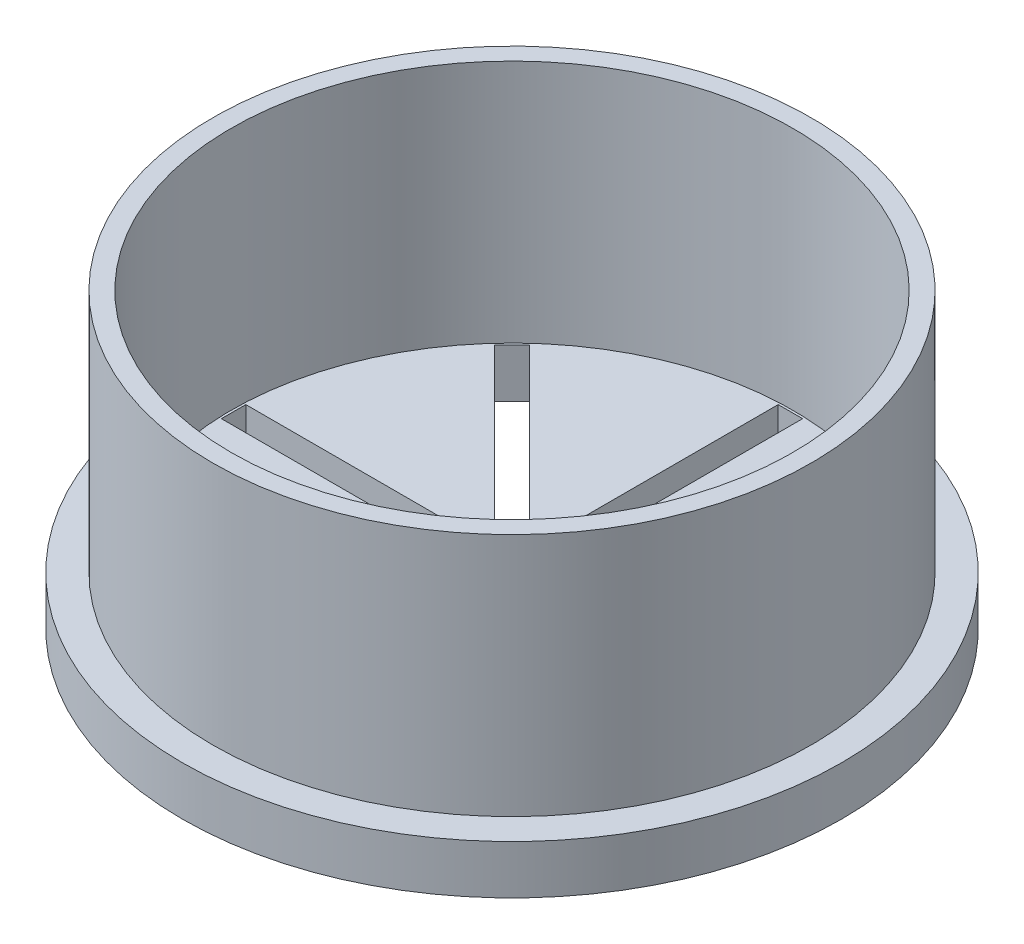
ISO-10303-21;
HEADER;
FILE_DESCRIPTION(('STEP AP214'),'2;1');
FILE_NAME('part.step','',(''),(''),'','','');
FILE_SCHEMA(('AUTOMOTIVE_DESIGN { 1 0 10303 214 1 1 1 1 }'));
ENDSEC;
DATA;
#1=APPLICATION_CONTEXT('core data for automotive mechanical design processes');
#2=APPLICATION_PROTOCOL_DEFINITION('international standard','automotive_design',2000,#1);
#3=PRODUCT_CONTEXT('',#1,'mechanical');
#4=PRODUCT('Part','Part','',(#3));
#5=PRODUCT_RELATED_PRODUCT_CATEGORY('part','',(#4));
#6=PRODUCT_DEFINITION_FORMATION('','',#4);
#7=PRODUCT_DEFINITION_CONTEXT('part definition',#1,'design');
#8=PRODUCT_DEFINITION('design','',#6,#7);
#9=PRODUCT_DEFINITION_SHAPE('','',#8);
#10=(LENGTH_UNIT() NAMED_UNIT(*) SI_UNIT(.MILLI.,.METRE.));
#11=(NAMED_UNIT(*) PLANE_ANGLE_UNIT() SI_UNIT($,.RADIAN.));
#12=(NAMED_UNIT(*) SI_UNIT($,.STERADIAN.) SOLID_ANGLE_UNIT());
#13=UNCERTAINTY_MEASURE_WITH_UNIT(LENGTH_MEASURE(1.E-05),#10,'distance_accuracy_value','');
#14=(GEOMETRIC_REPRESENTATION_CONTEXT(3) GLOBAL_UNCERTAINTY_ASSIGNED_CONTEXT((#13)) GLOBAL_UNIT_ASSIGNED_CONTEXT((#10,
#11,#12)) REPRESENTATION_CONTEXT('',''));
#15=CARTESIAN_POINT('',(0.,0.,0.));
#16=DIRECTION('',(0.,0.,1.));
#17=DIRECTION('',(1.,0.,0.));
#18=AXIS2_PLACEMENT_3D('',#15,#16,#17);
#19=CARTESIAN_POINT('',(0.,2.,0.));
#20=DIRECTION('',(0.,1.,0.));
#21=DIRECTION('',(0.,0.,1.));
#22=AXIS2_PLACEMENT_3D('',#19,#20,#21);
#23=PLANE('',#22);
#24=CARTESIAN_POINT('',(0.,2.,0.));
#25=DIRECTION('',(0.,1.,0.));
#26=DIRECTION('',(0.,0.,1.));
#27=AXIS2_PLACEMENT_3D('',#24,#25,#26);
#28=CIRCLE('',#27,13.5);
#29=CARTESIAN_POINT('',(0.,2.,13.5));
#30=VERTEX_POINT('',#29);
#31=EDGE_CURVE('E12',#30,#30,#28,.T.);
#32=ORIENTED_EDGE('',*,*,#31,.T.);
#33=EDGE_LOOP('',(#32));
#34=FACE_BOUND('',#33,.T.);
#35=CARTESIAN_POINT('',(0.,2.,0.));
#36=DIRECTION('',(0.,1.,0.));
#37=DIRECTION('',(0.,0.,1.));
#38=AXIS2_PLACEMENT_3D('',#35,#36,#37);
#39=CIRCLE('',#38,12.25);
#40=CARTESIAN_POINT('',(0.,2.,12.25));
#41=VERTEX_POINT('',#40);
#42=EDGE_CURVE('E578',#41,#41,#39,.T.);
#43=ORIENTED_EDGE('',*,*,#42,.F.);
#44=EDGE_LOOP('',(#43));
#45=FACE_BOUND('',#44,.T.);
#46=ADVANCED_FACE('F177',(#34,#45),#23,.T.);
#47=CARTESIAN_POINT('',(0.,2.,0.));
#48=DIRECTION('',(0.,-1.,0.));
#49=DIRECTION('',(0.,0.,-1.));
#50=AXIS2_PLACEMENT_3D('',#47,#48,#49);
#51=CYLINDRICAL_SURFACE('',#50,13.5);
#52=ORIENTED_EDGE('',*,*,#31,.F.);
#53=EDGE_LOOP('',(#52));
#54=FACE_BOUND('',#53,.T.);
#55=CARTESIAN_POINT('',(0.,0.,0.));
#56=DIRECTION('',(0.,1.,0.));
#57=DIRECTION('',(0.,0.,1.));
#58=AXIS2_PLACEMENT_3D('',#55,#56,#57);
#59=CIRCLE('',#58,13.5);
#60=CARTESIAN_POINT('',(0.,0.,13.5));
#61=VERTEX_POINT('',#60);
#62=EDGE_CURVE('E181',#61,#61,#59,.T.);
#63=ORIENTED_EDGE('',*,*,#62,.T.);
#64=EDGE_LOOP('',(#63));
#65=FACE_BOUND('',#64,.T.);
#66=ADVANCED_FACE('F179',(#54,#65),#51,.T.);
#67=CARTESIAN_POINT('',(0.,0.,0.));
#68=DIRECTION('',(0.,1.,0.));
#69=DIRECTION('',(0.,0.,1.));
#70=AXIS2_PLACEMENT_3D('',#67,#68,#69);
#71=PLANE('',#70);
#72=DIRECTION('',(-0.707106781186553,0.,-0.707106781186542));
#73=VECTOR('',#72,1.);
#74=CARTESIAN_POINT('',(8.41457069611994,0.,-7.70746391493348));
#75=LINE('',#74,#73);
#76=CARTESIAN_POINT('',(8.41457069611994,0.,-7.70746391493348));
#77=VERTEX_POINT('',#76);
#78=CARTESIAN_POINT('',(7.70746391493339,0.,-8.41457069612002));
#79=VERTEX_POINT('',#78);
#80=EDGE_CURVE('E533',#77,#79,#75,.T.);
#81=ORIENTED_EDGE('',*,*,#80,.T.);
#82=DIRECTION('',(-0.707106781186542,0.,0.707106781186553));
#83=VECTOR('',#82,1.);
#84=CARTESIAN_POINT('',(7.70746391493339,0.,-8.41457069612002));
#85=LINE('',#84,#83);
#86=CARTESIAN_POINT('',(0.500000000000043,0.,-1.20710678118655));
#87=VERTEX_POINT('',#86);
#88=EDGE_CURVE('E288',#79,#87,#85,.T.);
#89=ORIENTED_EDGE('',*,*,#88,.T.);
#90=DIRECTION('',(0.,0.,1.));
#91=VECTOR('',#90,1.);
#92=CARTESIAN_POINT('',(0.499999999999989,0.,-11.4000000000001));
#93=LINE('',#92,#91);
#94=CARTESIAN_POINT('',(0.499999999999989,0.,-11.4000000000001));
#95=VERTEX_POINT('',#94);
#96=EDGE_CURVE('E264',#95,#87,#93,.T.);
#97=ORIENTED_EDGE('',*,*,#96,.F.);
#98=DIRECTION('',(-1.,0.,0.));
#99=VECTOR('',#98,1.);
#100=CARTESIAN_POINT('',(0.499999999999989,0.,-11.4000000000001));
#101=LINE('',#100,#99);
#102=CARTESIAN_POINT('',(-0.500000000000011,0.,-11.4000000000001));
#103=VERTEX_POINT('',#102);
#104=EDGE_CURVE('E275',#95,#103,#101,.T.);
#105=ORIENTED_EDGE('',*,*,#104,.T.);
#106=DIRECTION('',(0.,0.,1.));
#107=VECTOR('',#106,1.);
#108=CARTESIAN_POINT('',(-0.500000000000011,0.,-11.4000000000001));
#109=LINE('',#108,#107);
#110=CARTESIAN_POINT('',(-0.499999999999956,0.,-1.20710678118655));
#111=VERTEX_POINT('',#110);
#112=EDGE_CURVE('E414',#103,#111,#109,.T.);
#113=ORIENTED_EDGE('',*,*,#112,.T.);
#114=DIRECTION('',(0.707106781186549,0.,0.707106781186546));
#115=VECTOR('',#114,1.);
#116=CARTESIAN_POINT('',(-7.70746391493338,0.,-8.41457069611993));
#117=LINE('',#116,#115);
#118=CARTESIAN_POINT('',(-7.70746391493338,0.,-8.41457069611993));
#119=VERTEX_POINT('',#118);
#120=EDGE_CURVE('E389',#119,#111,#117,.T.);
#121=ORIENTED_EDGE('',*,*,#120,.F.);
#122=DIRECTION('',(-0.707106781186545,0.,0.70710678118655));
#123=VECTOR('',#122,1.);
#124=CARTESIAN_POINT('',(-7.70746391493338,0.,-8.41457069611993));
#125=LINE('',#124,#123);
#126=CARTESIAN_POINT('',(-8.41457069611992,0.,-7.70746391493338));
#127=VERTEX_POINT('',#126);
#128=EDGE_CURVE('E378',#119,#127,#125,.T.);
#129=ORIENTED_EDGE('',*,*,#128,.T.);
#130=DIRECTION('',(0.707106781186549,0.,0.707106781186546));
#131=VECTOR('',#130,1.);
#132=CARTESIAN_POINT('',(-8.41457069611992,0.,-7.70746391493338));
#133=LINE('',#132,#131);
#134=CARTESIAN_POINT('',(-1.2071067811865,0.,-0.499999999999999));
#135=VERTEX_POINT('',#134);
#136=EDGE_CURVE('E383',#127,#135,#133,.T.);
#137=ORIENTED_EDGE('',*,*,#136,.T.);
#138=DIRECTION('',(1.,0.,0.));
#139=VECTOR('',#138,1.);
#140=CARTESIAN_POINT('',(-11.4,0.,-0.5));
#141=LINE('',#140,#139);
#142=CARTESIAN_POINT('',(-11.4,0.,-0.5));
#143=VERTEX_POINT('',#142);
#144=EDGE_CURVE('E377',#143,#135,#141,.T.);
#145=ORIENTED_EDGE('',*,*,#144,.F.);
#146=DIRECTION('',(0.,0.,1.));
#147=VECTOR('',#146,1.);
#148=CARTESIAN_POINT('',(-11.4,0.,-0.5));
#149=LINE('',#148,#147);
#150=CARTESIAN_POINT('',(-11.4,0.,0.5));
#151=VERTEX_POINT('',#150);
#152=EDGE_CURVE('E192',#143,#151,#149,.T.);
#153=ORIENTED_EDGE('',*,*,#152,.T.);
#154=DIRECTION('',(1.,0.,0.));
#155=VECTOR('',#154,1.);
#156=CARTESIAN_POINT('',(-11.4,0.,0.5));
#157=LINE('',#156,#155);
#158=CARTESIAN_POINT('',(-1.20710678118648,0.,0.499999999999999));
#159=VERTEX_POINT('',#158);
#160=EDGE_CURVE('E545',#151,#159,#157,.T.);
#161=ORIENTED_EDGE('',*,*,#160,.T.);
#162=CARTESIAN_POINT('',(-8.41457069611976,0.,7.70746391493339));
#163=VERTEX_POINT('',#162);
#164=EDGE_CURVE('E344',#159,#163,#85,.T.);
#165=ORIENTED_EDGE('',*,*,#164,.T.);
#166=DIRECTION('',(-0.707106781186554,0.,-0.707106781186541));
#167=VECTOR('',#166,1.);
#168=CARTESIAN_POINT('',(-7.70746391493321,0.,8.41457069611993));
#169=LINE('',#168,#167);
#170=CARTESIAN_POINT('',(-7.70746391493321,0.,8.41457069611993));
#171=VERTEX_POINT('',#170);
#172=EDGE_CURVE('E573',#171,#163,#169,.T.);
#173=ORIENTED_EDGE('',*,*,#172,.F.);
#174=DIRECTION('',(-0.707106781186542,0.,0.707106781186553));
#175=VECTOR('',#174,1.);
#176=CARTESIAN_POINT('',(8.41457069611994,0.,-7.70746391493348));
#177=LINE('',#176,#175);
#178=CARTESIAN_POINT('',(-0.499999999999944,0.,1.20710678118655));
#179=VERTEX_POINT('',#178);
#180=EDGE_CURVE('E423',#179,#171,#177,.T.);
#181=ORIENTED_EDGE('',*,*,#180,.F.);
#182=CARTESIAN_POINT('',(-0.499999999999888,0.,11.3999999999999));
#183=VERTEX_POINT('',#182);
#184=EDGE_CURVE('E282',#179,#183,#109,.T.);
#185=ORIENTED_EDGE('',*,*,#184,.T.);
#186=DIRECTION('',(-1.,0.,0.));
#187=VECTOR('',#186,1.);
#188=CARTESIAN_POINT('',(0.500000000000112,0.,11.3999999999999));
#189=LINE('',#188,#187);
#190=CARTESIAN_POINT('',(0.500000000000112,0.,11.3999999999999));
#191=VERTEX_POINT('',#190);
#192=EDGE_CURVE('E293',#191,#183,#189,.T.);
#193=ORIENTED_EDGE('',*,*,#192,.F.);
#194=CARTESIAN_POINT('',(0.500000000000057,0.,1.20710678118655));
#195=VERTEX_POINT('',#194);
#196=EDGE_CURVE('E289',#195,#191,#93,.T.);
#197=ORIENTED_EDGE('',*,*,#196,.F.);
#198=CARTESIAN_POINT('',(7.7074639149334,0.,8.41457069611985));
#199=VERTEX_POINT('',#198);
#200=EDGE_CURVE('E381',#195,#199,#133,.T.);
#201=ORIENTED_EDGE('',*,*,#200,.T.);
#202=DIRECTION('',(-0.707106781186545,0.,0.707106781186551));
#203=VECTOR('',#202,1.);
#204=CARTESIAN_POINT('',(8.41457069611995,0.,7.7074639149333));
#205=LINE('',#204,#203);
#206=CARTESIAN_POINT('',(8.41457069611995,0.,7.7074639149333));
#207=VERTEX_POINT('',#206);
#208=EDGE_CURVE('E386',#207,#199,#205,.T.);
#209=ORIENTED_EDGE('',*,*,#208,.F.);
#210=CARTESIAN_POINT('',(1.2071067811866,0.,0.499999999999999));
#211=VERTEX_POINT('',#210);
#212=EDGE_CURVE('E388',#211,#207,#117,.T.);
#213=ORIENTED_EDGE('',*,*,#212,.F.);
#214=CARTESIAN_POINT('',(11.4,0.,0.5));
#215=VERTEX_POINT('',#214);
#216=EDGE_CURVE('E544',#211,#215,#157,.T.);
#217=ORIENTED_EDGE('',*,*,#216,.T.);
#218=DIRECTION('',(0.,0.,1.));
#219=VECTOR('',#218,1.);
#220=CARTESIAN_POINT('',(11.4,0.,-0.5));
#221=LINE('',#220,#219);
#222=CARTESIAN_POINT('',(11.4,0.,-0.5));
#223=VERTEX_POINT('',#222);
#224=EDGE_CURVE('E547',#223,#215,#221,.T.);
#225=ORIENTED_EDGE('',*,*,#224,.F.);
#226=CARTESIAN_POINT('',(1.20710678118658,0.,-0.5));
#227=VERTEX_POINT('',#226);
#228=EDGE_CURVE('E548',#227,#223,#141,.T.);
#229=ORIENTED_EDGE('',*,*,#228,.F.);
#230=EDGE_CURVE('E542',#77,#227,#177,.T.);
#231=ORIENTED_EDGE('',*,*,#230,.F.);
#232=EDGE_LOOP('',(#81,#89,#97,#105,#113,#121,#129,#137,#145,#153,#161,#165,#173,#181,#185,#193,
#197,#201,#209,#213,#217,#225,#229,#231));
#233=FACE_BOUND('',#232,.T.);
#234=ORIENTED_EDGE('',*,*,#62,.F.);
#235=EDGE_LOOP('',(#234));
#236=FACE_BOUND('',#235,.T.);
#237=ADVANCED_FACE('F285',(#233,#236),#71,.F.);
#238=CARTESIAN_POINT('',(8.41457069611994,0.,-7.70746391493348));
#239=DIRECTION('',(-0.707106781186553,0.,-0.707106781186542));
#240=DIRECTION('',(-0.707106781186542,0.,0.707106781186553));
#241=AXIS2_PLACEMENT_3D('',#238,#239,#240);
#242=PLANE('',#241);
#243=ORIENTED_EDGE('',*,*,#180,.T.);
#244=DIRECTION('',(0.,1.,0.));
#245=VECTOR('',#244,1.);
#246=CARTESIAN_POINT('',(-7.70746391493321,0.,8.41457069611993));
#247=LINE('',#246,#245);
#248=CARTESIAN_POINT('',(-7.70746391493321,2.,8.41457069611993));
#249=VERTEX_POINT('',#248);
#250=EDGE_CURVE('E536',#171,#249,#247,.T.);
#251=ORIENTED_EDGE('',*,*,#250,.T.);
#252=DIRECTION('',(-0.707106781186542,0.,0.707106781186553));
#253=VECTOR('',#252,1.);
#254=CARTESIAN_POINT('',(8.41457069611994,2.,-7.70746391493348));
#255=LINE('',#254,#253);
#256=CARTESIAN_POINT('',(-0.499999999999943,2.,1.20710678118655));
#257=VERTEX_POINT('',#256);
#258=EDGE_CURVE('E526',#257,#249,#255,.T.);
#259=ORIENTED_EDGE('',*,*,#258,.F.);
#260=DIRECTION('',(0.,1.,0.));
#261=VECTOR('',#260,1.);
#262=CARTESIAN_POINT('',(-0.499999999999945,0.,1.20710678118656));
#263=LINE('',#262,#261);
#264=EDGE_CURVE('E325',#179,#257,#263,.T.);
#265=ORIENTED_EDGE('',*,*,#264,.F.);
#266=EDGE_LOOP('',(#243,#251,#259,#265));
#267=FACE_BOUND('',#266,.T.);
#268=ADVANCED_FACE('F619',(#267),#242,.T.);
#269=CARTESIAN_POINT('',(-7.70746391493321,0.,8.41457069611993));
#270=DIRECTION('',(0.707106781186541,0.,-0.707106781186554));
#271=DIRECTION('',(-0.707106781186554,0.,-0.707106781186541));
#272=AXIS2_PLACEMENT_3D('',#269,#270,#271);
#273=PLANE('',#272);
#274=DIRECTION('',(-0.707106781186554,0.,-0.707106781186541));
#275=VECTOR('',#274,1.);
#276=CARTESIAN_POINT('',(-7.70746391493321,2.,8.41457069611993));
#277=LINE('',#276,#275);
#278=CARTESIAN_POINT('',(-8.41457069611976,2.,7.7074639149334));
#279=VERTEX_POINT('',#278);
#280=EDGE_CURVE('E524',#249,#279,#277,.T.);
#281=ORIENTED_EDGE('',*,*,#280,.F.);
#282=ORIENTED_EDGE('',*,*,#250,.F.);
#283=ORIENTED_EDGE('',*,*,#172,.T.);
#284=DIRECTION('',(0.,1.,0.));
#285=VECTOR('',#284,1.);
#286=CARTESIAN_POINT('',(-8.41457069611976,0.,7.70746391493339));
#287=LINE('',#286,#285);
#288=EDGE_CURVE('E539',#163,#279,#287,.T.);
#289=ORIENTED_EDGE('',*,*,#288,.T.);
#290=EDGE_LOOP('',(#281,#282,#283,#289));
#291=FACE_BOUND('',#290,.T.);
#292=ADVANCED_FACE('F623',(#291),#273,.T.);
#293=CARTESIAN_POINT('',(7.70746391493339,0.,-8.41457069612002));
#294=DIRECTION('',(-0.707106781186553,0.,-0.707106781186542));
#295=DIRECTION('',(-0.707106781186542,0.,0.707106781186553));
#296=AXIS2_PLACEMENT_3D('',#293,#294,#295);
#297=PLANE('',#296);
#298=DIRECTION('',(0.,1.,0.));
#299=VECTOR('',#298,1.);
#300=CARTESIAN_POINT('',(-1.20710678118648,0.,0.5));
#301=LINE('',#300,#299);
#302=CARTESIAN_POINT('',(-1.20710678118648,2.,0.5));
#303=VERTEX_POINT('',#302);
#304=EDGE_CURVE('E201',#159,#303,#301,.T.);
#305=ORIENTED_EDGE('',*,*,#304,.T.);
#306=DIRECTION('',(-0.707106781186542,0.,0.707106781186553));
#307=VECTOR('',#306,1.);
#308=CARTESIAN_POINT('',(7.70746391493339,2.,-8.41457069612002));
#309=LINE('',#308,#307);
#310=EDGE_CURVE('E341',#303,#279,#309,.T.);
#311=ORIENTED_EDGE('',*,*,#310,.T.);
#312=ORIENTED_EDGE('',*,*,#288,.F.);
#313=ORIENTED_EDGE('',*,*,#164,.F.);
#314=EDGE_LOOP('',(#305,#311,#312,#313));
#315=FACE_BOUND('',#314,.T.);
#316=ADVANCED_FACE('F337',(#315),#297,.F.);
#317=CARTESIAN_POINT('',(-7.70746391493338,0.,-8.41457069611993));
#318=DIRECTION('',(-0.707106781186546,0.,0.707106781186549));
#319=DIRECTION('',(0.707106781186549,0.,0.707106781186546));
#320=AXIS2_PLACEMENT_3D('',#317,#318,#319);
#321=PLANE('',#320);
#322=DIRECTION('',(0.,-1.,0.));
#323=VECTOR('',#322,1.);
#324=CARTESIAN_POINT('',(1.2071067811866,0.,0.5));
#325=LINE('',#324,#323);
#326=CARTESIAN_POINT('',(1.2071067811866,2.,0.5));
#327=VERTEX_POINT('',#326);
#328=EDGE_CURVE('E319',#327,#211,#325,.T.);
#329=ORIENTED_EDGE('',*,*,#328,.T.);
#330=ORIENTED_EDGE('',*,*,#212,.T.);
#331=DIRECTION('',(0.,1.,0.));
#332=VECTOR('',#331,1.);
#333=CARTESIAN_POINT('',(8.41457069611995,0.,7.7074639149333));
#334=LINE('',#333,#332);
#335=CARTESIAN_POINT('',(8.41457069611995,2.,7.7074639149333));
#336=VERTEX_POINT('',#335);
#337=EDGE_CURVE('E407',#207,#336,#334,.T.);
#338=ORIENTED_EDGE('',*,*,#337,.T.);
#339=DIRECTION('',(0.707106781186549,0.,0.707106781186546));
#340=VECTOR('',#339,1.);
#341=CARTESIAN_POINT('',(-7.70746391493338,2.,-8.41457069611993));
#342=LINE('',#341,#340);
#343=EDGE_CURVE('E402',#327,#336,#342,.T.);
#344=ORIENTED_EDGE('',*,*,#343,.F.);
#345=EDGE_LOOP('',(#329,#330,#338,#344));
#346=FACE_BOUND('',#345,.T.);
#347=ADVANCED_FACE('F637',(#346),#321,.T.);
#348=CARTESIAN_POINT('',(8.41457069611995,0.,7.7074639149333));
#349=DIRECTION('',(-0.707106781186551,0.,-0.707106781186545));
#350=DIRECTION('',(-0.707106781186545,0.,0.707106781186551));
#351=AXIS2_PLACEMENT_3D('',#348,#349,#350);
#352=PLANE('',#351);
#353=DIRECTION('',(-0.707106781186545,0.,0.707106781186551));
#354=VECTOR('',#353,1.);
#355=CARTESIAN_POINT('',(8.41457069611995,2.,7.7074639149333));
#356=LINE('',#355,#354);
#357=CARTESIAN_POINT('',(7.7074639149334,2.,8.41457069611985));
#358=VERTEX_POINT('',#357);
#359=EDGE_CURVE('E399',#336,#358,#356,.T.);
#360=ORIENTED_EDGE('',*,*,#359,.F.);
#361=ORIENTED_EDGE('',*,*,#337,.F.);
#362=ORIENTED_EDGE('',*,*,#208,.T.);
#363=DIRECTION('',(0.,1.,0.));
#364=VECTOR('',#363,1.);
#365=CARTESIAN_POINT('',(7.7074639149334,0.,8.41457069611985));
#366=LINE('',#365,#364);
#367=EDGE_CURVE('E410',#199,#358,#366,.T.);
#368=ORIENTED_EDGE('',*,*,#367,.T.);
#369=EDGE_LOOP('',(#360,#361,#362,#368));
#370=FACE_BOUND('',#369,.T.);
#371=ADVANCED_FACE('F642',(#370),#352,.T.);
#372=CARTESIAN_POINT('',(-8.41457069611992,0.,-7.70746391493338));
#373=DIRECTION('',(-0.707106781186546,0.,0.707106781186549));
#374=DIRECTION('',(0.707106781186549,0.,0.707106781186546));
#375=AXIS2_PLACEMENT_3D('',#372,#373,#374);
#376=PLANE('',#375);
#377=DIRECTION('',(0.707106781186549,0.,0.707106781186546));
#378=VECTOR('',#377,1.);
#379=CARTESIAN_POINT('',(-8.41457069611992,2.,-7.70746391493338));
#380=LINE('',#379,#378);
#381=CARTESIAN_POINT('',(0.500000000000057,2.,1.20710678118655));
#382=VERTEX_POINT('',#381);
#383=EDGE_CURVE('E395',#382,#358,#380,.T.);
#384=ORIENTED_EDGE('',*,*,#383,.T.);
#385=ORIENTED_EDGE('',*,*,#367,.F.);
#386=ORIENTED_EDGE('',*,*,#200,.F.);
#387=DIRECTION('',(0.,-1.,0.));
#388=VECTOR('',#387,1.);
#389=CARTESIAN_POINT('',(0.500000000000054,0.,1.20710678118654));
#390=LINE('',#389,#388);
#391=EDGE_CURVE('E316',#382,#195,#390,.T.);
#392=ORIENTED_EDGE('',*,*,#391,.F.);
#393=EDGE_LOOP('',(#384,#385,#386,#392));
#394=FACE_BOUND('',#393,.T.);
#395=ADVANCED_FACE('F733',(#394),#376,.F.);
#396=CARTESIAN_POINT('',(0.499999999999989,0.,-11.4000000000001));
#397=DIRECTION('',(-1.,0.,0.));
#398=DIRECTION('',(0.,0.,1.));
#399=AXIS2_PLACEMENT_3D('',#396,#397,#398);
#400=PLANE('',#399);
#401=ORIENTED_EDGE('',*,*,#391,.T.);
#402=ORIENTED_EDGE('',*,*,#196,.T.);
#403=DIRECTION('',(0.,1.,0.));
#404=VECTOR('',#403,1.);
#405=CARTESIAN_POINT('',(0.500000000000112,0.,11.3999999999999));
#406=LINE('',#405,#404);
#407=CARTESIAN_POINT('',(0.500000000000112,2.,11.3999999999999));
#408=VERTEX_POINT('',#407);
#409=EDGE_CURVE('E272',#191,#408,#406,.T.);
#410=ORIENTED_EDGE('',*,*,#409,.T.);
#411=DIRECTION('',(0.,0.,1.));
#412=VECTOR('',#411,1.);
#413=CARTESIAN_POINT('',(0.499999999999989,2.,-11.4000000000001));
#414=LINE('',#413,#412);
#415=EDGE_CURVE('E307',#382,#408,#414,.T.);
#416=ORIENTED_EDGE('',*,*,#415,.F.);
#417=EDGE_LOOP('',(#401,#402,#410,#416));
#418=FACE_BOUND('',#417,.T.);
#419=ADVANCED_FACE('F707',(#418),#400,.T.);
#420=CARTESIAN_POINT('',(0.500000000000112,0.,11.3999999999999));
#421=DIRECTION('',(0.,0.,-1.));
#422=DIRECTION('',(-1.,0.,0.));
#423=AXIS2_PLACEMENT_3D('',#420,#421,#422);
#424=PLANE('',#423);
#425=DIRECTION('',(-1.,0.,0.));
#426=VECTOR('',#425,1.);
#427=CARTESIAN_POINT('',(0.500000000000112,2.,11.3999999999999));
#428=LINE('',#427,#426);
#429=CARTESIAN_POINT('',(-0.499999999999888,2.,11.3999999999999));
#430=VERTEX_POINT('',#429);
#431=EDGE_CURVE('E304',#408,#430,#428,.T.);
#432=ORIENTED_EDGE('',*,*,#431,.F.);
#433=ORIENTED_EDGE('',*,*,#409,.F.);
#434=ORIENTED_EDGE('',*,*,#192,.T.);
#435=DIRECTION('',(0.,1.,0.));
#436=VECTOR('',#435,1.);
#437=CARTESIAN_POINT('',(-0.499999999999888,0.,11.3999999999999));
#438=LINE('',#437,#436);
#439=EDGE_CURVE('E291',#183,#430,#438,.T.);
#440=ORIENTED_EDGE('',*,*,#439,.T.);
#441=EDGE_LOOP('',(#432,#433,#434,#440));
#442=FACE_BOUND('',#441,.T.);
#443=ADVANCED_FACE('F780',(#442),#424,.T.);
#444=CARTESIAN_POINT('',(-0.500000000000011,0.,-11.4000000000001));
#445=DIRECTION('',(-1.,0.,0.));
#446=DIRECTION('',(0.,0.,1.));
#447=AXIS2_PLACEMENT_3D('',#444,#445,#446);
#448=PLANE('',#447);
#449=ORIENTED_EDGE('',*,*,#264,.T.);
#450=DIRECTION('',(0.,0.,1.));
#451=VECTOR('',#450,1.);
#452=CARTESIAN_POINT('',(-0.500000000000011,2.,-11.4000000000001));
#453=LINE('',#452,#451);
#454=EDGE_CURVE('E299',#257,#430,#453,.T.);
#455=ORIENTED_EDGE('',*,*,#454,.T.);
#456=ORIENTED_EDGE('',*,*,#439,.F.);
#457=ORIENTED_EDGE('',*,*,#184,.F.);
#458=EDGE_LOOP('',(#449,#455,#456,#457));
#459=FACE_BOUND('',#458,.T.);
#460=ADVANCED_FACE('F426',(#459),#448,.F.);
#461=CARTESIAN_POINT('',(11.4,0.,-0.5));
#462=DIRECTION('',(-1.,0.,0.));
#463=DIRECTION('',(0.,0.,1.));
#464=AXIS2_PLACEMENT_3D('',#461,#462,#463);
#465=PLANE('',#464);
#466=DIRECTION('',(0.,0.,1.));
#467=VECTOR('',#466,1.);
#468=CARTESIAN_POINT('',(11.4,2.,-0.5));
#469=LINE('',#468,#467);
#470=CARTESIAN_POINT('',(11.4,2.,-0.5));
#471=VERTEX_POINT('',#470);
#472=CARTESIAN_POINT('',(11.4,2.,0.5));
#473=VERTEX_POINT('',#472);
#474=EDGE_CURVE('E356',#471,#473,#469,.T.);
#475=ORIENTED_EDGE('',*,*,#474,.F.);
#476=DIRECTION('',(0.,1.,0.));
#477=VECTOR('',#476,1.);
#478=CARTESIAN_POINT('',(11.4,0.,-0.5));
#479=LINE('',#478,#477);
#480=EDGE_CURVE('E370',#223,#471,#479,.T.);
#481=ORIENTED_EDGE('',*,*,#480,.F.);
#482=ORIENTED_EDGE('',*,*,#224,.T.);
#483=DIRECTION('',(0.,1.,0.));
#484=VECTOR('',#483,1.);
#485=CARTESIAN_POINT('',(11.4,0.,0.5));
#486=LINE('',#485,#484);
#487=EDGE_CURVE('E373',#215,#473,#486,.T.);
#488=ORIENTED_EDGE('',*,*,#487,.T.);
#489=EDGE_LOOP('',(#475,#481,#482,#488));
#490=FACE_BOUND('',#489,.T.);
#491=ADVANCED_FACE('F559',(#490),#465,.T.);
#492=CARTESIAN_POINT('',(-11.4,0.,0.5));
#493=DIRECTION('',(0.,0.,1.));
#494=DIRECTION('',(1.,0.,0.));
#495=AXIS2_PLACEMENT_3D('',#492,#493,#494);
#496=PLANE('',#495);
#497=DIRECTION('',(1.,0.,0.));
#498=VECTOR('',#497,1.);
#499=CARTESIAN_POINT('',(-11.4,2.,0.5));
#500=LINE('',#499,#498);
#501=EDGE_CURVE('E357',#327,#473,#500,.T.);
#502=ORIENTED_EDGE('',*,*,#501,.T.);
#503=ORIENTED_EDGE('',*,*,#487,.F.);
#504=ORIENTED_EDGE('',*,*,#216,.F.);
#505=ORIENTED_EDGE('',*,*,#328,.F.);
#506=EDGE_LOOP('',(#502,#503,#504,#505));
#507=FACE_BOUND('',#506,.T.);
#508=ADVANCED_FACE('F567',(#507),#496,.F.);
#509=CARTESIAN_POINT('',(-11.4,0.,-0.5));
#510=DIRECTION('',(0.,0.,1.));
#511=DIRECTION('',(1.,0.,0.));
#512=AXIS2_PLACEMENT_3D('',#509,#510,#511);
#513=PLANE('',#512);
#514=ORIENTED_EDGE('',*,*,#228,.T.);
#515=ORIENTED_EDGE('',*,*,#480,.T.);
#516=DIRECTION('',(1.,0.,0.));
#517=VECTOR('',#516,1.);
#518=CARTESIAN_POINT('',(-11.4,2.,-0.5));
#519=LINE('',#518,#517);
#520=CARTESIAN_POINT('',(1.20710678118658,2.,-0.5));
#521=VERTEX_POINT('',#520);
#522=EDGE_CURVE('E360',#521,#471,#519,.T.);
#523=ORIENTED_EDGE('',*,*,#522,.F.);
#524=DIRECTION('',(0.,1.,0.));
#525=VECTOR('',#524,1.);
#526=CARTESIAN_POINT('',(1.20710678118658,0.,-0.5));
#527=LINE('',#526,#525);
#528=EDGE_CURVE('E328',#227,#521,#527,.T.);
#529=ORIENTED_EDGE('',*,*,#528,.F.);
#530=EDGE_LOOP('',(#514,#515,#523,#529));
#531=FACE_BOUND('',#530,.T.);
#532=ADVANCED_FACE('F552',(#531),#513,.T.);
#533=ORIENTED_EDGE('',*,*,#88,.F.);
#534=DIRECTION('',(0.,1.,0.));
#535=VECTOR('',#534,1.);
#536=CARTESIAN_POINT('',(7.70746391493339,0.,-8.41457069612002));
#537=LINE('',#536,#535);
#538=CARTESIAN_POINT('',(7.70746391493339,2.,-8.41457069612002));
#539=VERTEX_POINT('',#538);
#540=EDGE_CURVE('E522',#79,#539,#537,.T.);
#541=ORIENTED_EDGE('',*,*,#540,.T.);
#542=CARTESIAN_POINT('',(0.500000000000044,2.,-1.20710678118655));
#543=VERTEX_POINT('',#542);
#544=EDGE_CURVE('E518',#539,#543,#309,.T.);
#545=ORIENTED_EDGE('',*,*,#544,.T.);
#546=DIRECTION('',(0.,1.,0.));
#547=VECTOR('',#546,1.);
#548=CARTESIAN_POINT('',(0.500000000000044,0.,-1.20710678118656));
#549=LINE('',#548,#547);
#550=EDGE_CURVE('E329',#87,#543,#549,.T.);
#551=ORIENTED_EDGE('',*,*,#550,.F.);
#552=EDGE_LOOP('',(#533,#541,#545,#551));
#553=FACE_BOUND('',#552,.T.);
#554=ADVANCED_FACE('F521',(#553),#297,.F.);
#555=CARTESIAN_POINT('',(8.41457069611994,0.,-7.70746391493348));
#556=DIRECTION('',(0.707106781186542,0.,-0.707106781186553));
#557=DIRECTION('',(-0.707106781186553,0.,-0.707106781186542));
#558=AXIS2_PLACEMENT_3D('',#555,#556,#557);
#559=PLANE('',#558);
#560=DIRECTION('',(-0.707106781186553,0.,-0.707106781186542));
#561=VECTOR('',#560,1.);
#562=CARTESIAN_POINT('',(8.41457069611994,2.,-7.70746391493348));
#563=LINE('',#562,#561);
#564=CARTESIAN_POINT('',(8.41457069611994,2.,-7.70746391493348));
#565=VERTEX_POINT('',#564);
#566=EDGE_CURVE('E324',#565,#539,#563,.T.);
#567=ORIENTED_EDGE('',*,*,#566,.T.);
#568=ORIENTED_EDGE('',*,*,#540,.F.);
#569=ORIENTED_EDGE('',*,*,#80,.F.);
#570=DIRECTION('',(0.,1.,0.));
#571=VECTOR('',#570,1.);
#572=CARTESIAN_POINT('',(8.41457069611994,0.,-7.70746391493348));
#573=LINE('',#572,#571);
#574=EDGE_CURVE('E331',#77,#565,#573,.T.);
#575=ORIENTED_EDGE('',*,*,#574,.T.);
#576=EDGE_LOOP('',(#567,#568,#569,#575));
#577=FACE_BOUND('',#576,.T.);
#578=ADVANCED_FACE('F626',(#577),#559,.F.);
#579=ORIENTED_EDGE('',*,*,#528,.T.);
#580=EDGE_CURVE('E531',#565,#521,#255,.T.);
#581=ORIENTED_EDGE('',*,*,#580,.F.);
#582=ORIENTED_EDGE('',*,*,#574,.F.);
#583=ORIENTED_EDGE('',*,*,#230,.T.);
#584=EDGE_LOOP('',(#579,#581,#582,#583));
#585=FACE_BOUND('',#584,.T.);
#586=ADVANCED_FACE('F571',(#585),#242,.T.);
#587=CARTESIAN_POINT('',(-7.70746391493338,0.,-8.41457069611993));
#588=DIRECTION('',(-0.70710678118655,0.,-0.707106781186545));
#589=DIRECTION('',(-0.707106781186545,0.,0.70710678118655));
#590=AXIS2_PLACEMENT_3D('',#587,#588,#589);
#591=PLANE('',#590);
#592=DIRECTION('',(-0.707106781186545,0.,0.70710678118655));
#593=VECTOR('',#592,1.);
#594=CARTESIAN_POINT('',(-7.70746391493338,2.,-8.41457069611993));
#595=LINE('',#594,#593);
#596=CARTESIAN_POINT('',(-7.70746391493338,2.,-8.41457069611993));
#597=VERTEX_POINT('',#596);
#598=CARTESIAN_POINT('',(-8.41457069611992,2.,-7.70746391493338));
#599=VERTEX_POINT('',#598);
#600=EDGE_CURVE('E271',#597,#599,#595,.T.);
#601=ORIENTED_EDGE('',*,*,#600,.T.);
#602=DIRECTION('',(0.,1.,0.));
#603=VECTOR('',#602,1.);
#604=CARTESIAN_POINT('',(-8.41457069611992,0.,-7.70746391493338));
#605=LINE('',#604,#603);
#606=EDGE_CURVE('E392',#127,#599,#605,.T.);
#607=ORIENTED_EDGE('',*,*,#606,.F.);
#608=ORIENTED_EDGE('',*,*,#128,.F.);
#609=DIRECTION('',(0.,1.,0.));
#610=VECTOR('',#609,1.);
#611=CARTESIAN_POINT('',(-7.70746391493338,0.,-8.41457069611993));
#612=LINE('',#611,#610);
#613=EDGE_CURVE('E318',#119,#597,#612,.T.);
#614=ORIENTED_EDGE('',*,*,#613,.T.);
#615=EDGE_LOOP('',(#601,#607,#608,#614));
#616=FACE_BOUND('',#615,.T.);
#617=ADVANCED_FACE('F510',(#616),#591,.F.);
#618=DIRECTION('',(0.,-1.,0.));
#619=VECTOR('',#618,1.);
#620=CARTESIAN_POINT('',(-1.2071067811865,0.,-0.5));
#621=LINE('',#620,#619);
#622=CARTESIAN_POINT('',(-1.2071067811865,2.,-0.5));
#623=VERTEX_POINT('',#622);
#624=EDGE_CURVE('E321',#623,#135,#621,.T.);
#625=ORIENTED_EDGE('',*,*,#624,.T.);
#626=ORIENTED_EDGE('',*,*,#136,.F.);
#627=ORIENTED_EDGE('',*,*,#606,.T.);
#628=EDGE_CURVE('E396',#599,#623,#380,.T.);
#629=ORIENTED_EDGE('',*,*,#628,.T.);
#630=EDGE_LOOP('',(#625,#626,#627,#629));
#631=FACE_BOUND('',#630,.T.);
#632=ADVANCED_FACE('F507',(#631),#376,.F.);
#633=CARTESIAN_POINT('',(-0.499999999999956,2.,-1.20710678118655));
#634=VERTEX_POINT('',#633);
#635=EDGE_CURVE('E382',#597,#634,#342,.T.);
#636=ORIENTED_EDGE('',*,*,#635,.F.);
#637=ORIENTED_EDGE('',*,*,#613,.F.);
#638=ORIENTED_EDGE('',*,*,#120,.T.);
#639=DIRECTION('',(0.,-1.,0.));
#640=VECTOR('',#639,1.);
#641=CARTESIAN_POINT('',(-0.499999999999956,0.,-1.20710678118655));
#642=LINE('',#641,#640);
#643=EDGE_CURVE('E313',#634,#111,#642,.T.);
#644=ORIENTED_EDGE('',*,*,#643,.F.);
#645=EDGE_LOOP('',(#636,#637,#638,#644));
#646=FACE_BOUND('',#645,.T.);
#647=ADVANCED_FACE('F514',(#646),#321,.T.);
#648=ORIENTED_EDGE('',*,*,#643,.T.);
#649=ORIENTED_EDGE('',*,*,#112,.F.);
#650=DIRECTION('',(0.,1.,0.));
#651=VECTOR('',#650,1.);
#652=CARTESIAN_POINT('',(-0.500000000000011,0.,-11.4000000000001));
#653=LINE('',#652,#651);
#654=CARTESIAN_POINT('',(-0.500000000000011,2.,-11.4000000000001));
#655=VERTEX_POINT('',#654);
#656=EDGE_CURVE('E278',#103,#655,#653,.T.);
#657=ORIENTED_EDGE('',*,*,#656,.T.);
#658=EDGE_CURVE('E301',#655,#634,#453,.T.);
#659=ORIENTED_EDGE('',*,*,#658,.T.);
#660=EDGE_LOOP('',(#648,#649,#657,#659));
#661=FACE_BOUND('',#660,.T.);
#662=ADVANCED_FACE('F516',(#661),#448,.F.);
#663=CARTESIAN_POINT('',(0.499999999999989,0.,-11.4000000000001));
#664=DIRECTION('',(0.,0.,-1.));
#665=DIRECTION('',(-1.,0.,0.));
#666=AXIS2_PLACEMENT_3D('',#663,#664,#665);
#667=PLANE('',#666);
#668=DIRECTION('',(-1.,0.,0.));
#669=VECTOR('',#668,1.);
#670=CARTESIAN_POINT('',(0.499999999999989,2.,-11.4000000000001));
#671=LINE('',#670,#669);
#672=CARTESIAN_POINT('',(0.499999999999989,2.,-11.4000000000001));
#673=VERTEX_POINT('',#672);
#674=EDGE_CURVE('E297',#673,#655,#671,.T.);
#675=ORIENTED_EDGE('',*,*,#674,.T.);
#676=ORIENTED_EDGE('',*,*,#656,.F.);
#677=ORIENTED_EDGE('',*,*,#104,.F.);
#678=DIRECTION('',(0.,1.,0.));
#679=VECTOR('',#678,1.);
#680=CARTESIAN_POINT('',(0.499999999999989,0.,-11.4000000000001));
#681=LINE('',#680,#679);
#682=EDGE_CURVE('E259',#95,#673,#681,.T.);
#683=ORIENTED_EDGE('',*,*,#682,.T.);
#684=EDGE_LOOP('',(#675,#676,#677,#683));
#685=FACE_BOUND('',#684,.T.);
#686=ADVANCED_FACE('F276',(#685),#667,.F.);
#687=ORIENTED_EDGE('',*,*,#550,.T.);
#688=EDGE_CURVE('E268',#673,#543,#414,.T.);
#689=ORIENTED_EDGE('',*,*,#688,.F.);
#690=ORIENTED_EDGE('',*,*,#682,.F.);
#691=ORIENTED_EDGE('',*,*,#96,.T.);
#692=EDGE_LOOP('',(#687,#689,#690,#691));
#693=FACE_BOUND('',#692,.T.);
#694=ADVANCED_FACE('F262',(#693),#400,.T.);
#695=ORIENTED_EDGE('',*,*,#160,.F.);
#696=DIRECTION('',(0.,1.,0.));
#697=VECTOR('',#696,1.);
#698=CARTESIAN_POINT('',(-11.4,0.,0.5));
#699=LINE('',#698,#697);
#700=CARTESIAN_POINT('',(-11.4,2.,0.5));
#701=VERTEX_POINT('',#700);
#702=EDGE_CURVE('E353',#151,#701,#699,.T.);
#703=ORIENTED_EDGE('',*,*,#702,.T.);
#704=EDGE_CURVE('E351',#701,#303,#500,.T.);
#705=ORIENTED_EDGE('',*,*,#704,.T.);
#706=ORIENTED_EDGE('',*,*,#304,.F.);
#707=EDGE_LOOP('',(#695,#703,#705,#706));
#708=FACE_BOUND('',#707,.T.);
#709=ADVANCED_FACE('F352',(#708),#496,.F.);
#710=CARTESIAN_POINT('',(-11.4,0.,-0.5));
#711=DIRECTION('',(-1.,0.,0.));
#712=DIRECTION('',(0.,0.,1.));
#713=AXIS2_PLACEMENT_3D('',#710,#711,#712);
#714=PLANE('',#713);
#715=DIRECTION('',(0.,0.,1.));
#716=VECTOR('',#715,1.);
#717=CARTESIAN_POINT('',(-11.4,2.,-0.5));
#718=LINE('',#717,#716);
#719=CARTESIAN_POINT('',(-11.4,2.,-0.5));
#720=VERTEX_POINT('',#719);
#721=EDGE_CURVE('E315',#720,#701,#718,.T.);
#722=ORIENTED_EDGE('',*,*,#721,.T.);
#723=ORIENTED_EDGE('',*,*,#702,.F.);
#724=ORIENTED_EDGE('',*,*,#152,.F.);
#725=DIRECTION('',(0.,1.,0.));
#726=VECTOR('',#725,1.);
#727=CARTESIAN_POINT('',(-11.4,0.,-0.5));
#728=LINE('',#727,#726);
#729=EDGE_CURVE('E322',#143,#720,#728,.T.);
#730=ORIENTED_EDGE('',*,*,#729,.T.);
#731=EDGE_LOOP('',(#722,#723,#724,#730));
#732=FACE_BOUND('',#731,.T.);
#733=ADVANCED_FACE('F685',(#732),#714,.F.);
#734=EDGE_CURVE('E366',#720,#623,#519,.T.);
#735=ORIENTED_EDGE('',*,*,#734,.F.);
#736=ORIENTED_EDGE('',*,*,#729,.F.);
#737=ORIENTED_EDGE('',*,*,#144,.T.);
#738=ORIENTED_EDGE('',*,*,#624,.F.);
#739=EDGE_LOOP('',(#735,#736,#737,#738));
#740=FACE_BOUND('',#739,.T.);
#741=ADVANCED_FACE('F503',(#740),#513,.T.);
#742=CARTESIAN_POINT('',(0.,12.,0.));
#743=DIRECTION('',(0.,-1.,0.));
#744=DIRECTION('',(0.,0.,-1.));
#745=AXIS2_PLACEMENT_3D('',#742,#743,#744);
#746=CYLINDRICAL_SURFACE('',#745,12.25);
#747=CARTESIAN_POINT('',(0.,12.,0.));
#748=DIRECTION('',(0.,1.,0.));
#749=DIRECTION('',(0.,0.,1.));
#750=AXIS2_PLACEMENT_3D('',#747,#748,#749);
#751=CIRCLE('',#750,12.25);
#752=CARTESIAN_POINT('',(0.,12.,12.25));
#753=VERTEX_POINT('',#752);
#754=EDGE_CURVE('E300',#753,#753,#751,.T.);
#755=ORIENTED_EDGE('',*,*,#754,.F.);
#756=EDGE_LOOP('',(#755));
#757=FACE_BOUND('',#756,.T.);
#758=ORIENTED_EDGE('',*,*,#42,.T.);
#759=EDGE_LOOP('',(#758));
#760=FACE_BOUND('',#759,.T.);
#761=ADVANCED_FACE('F600',(#757,#760),#746,.T.);
#762=CARTESIAN_POINT('',(0.,12.,0.));
#763=DIRECTION('',(0.,1.,0.));
#764=DIRECTION('',(0.,0.,1.));
#765=AXIS2_PLACEMENT_3D('',#762,#763,#764);
#766=PLANE('',#765);
#767=CARTESIAN_POINT('',(0.,12.,0.));
#768=DIRECTION('',(0.,1.,0.));
#769=DIRECTION('',(0.,0.,1.));
#770=AXIS2_PLACEMENT_3D('',#767,#768,#769);
#771=CIRCLE('',#770,11.5);
#772=CARTESIAN_POINT('',(0.,12.,11.5));
#773=VERTEX_POINT('',#772);
#774=EDGE_CURVE('E584',#773,#773,#771,.T.);
#775=ORIENTED_EDGE('',*,*,#774,.F.);
#776=EDGE_LOOP('',(#775));
#777=FACE_BOUND('',#776,.T.);
#778=ORIENTED_EDGE('',*,*,#754,.T.);
#779=EDGE_LOOP('',(#778));
#780=FACE_BOUND('',#779,.T.);
#781=ADVANCED_FACE('F597',(#777,#780),#766,.T.);
#782=CARTESIAN_POINT('',(0.,2.,0.));
#783=DIRECTION('',(0.,1.,0.));
#784=DIRECTION('',(0.,0.,1.));
#785=AXIS2_PLACEMENT_3D('',#782,#783,#784);
#786=PLANE('',#785);
#787=CARTESIAN_POINT('',(0.,2.,0.));
#788=DIRECTION('',(0.,1.,0.));
#789=DIRECTION('',(0.,0.,1.));
#790=AXIS2_PLACEMENT_3D('',#787,#788,#789);
#791=CIRCLE('',#790,11.5);
#792=CARTESIAN_POINT('',(0.,2.,11.5));
#793=VERTEX_POINT('',#792);
#794=EDGE_CURVE('E581',#793,#793,#791,.T.);
#795=ORIENTED_EDGE('',*,*,#794,.T.);
#796=EDGE_LOOP('',(#795));
#797=FACE_BOUND('',#796,.T.);
#798=ORIENTED_EDGE('',*,*,#544,.F.);
#799=ORIENTED_EDGE('',*,*,#566,.F.);
#800=ORIENTED_EDGE('',*,*,#580,.T.);
#801=ORIENTED_EDGE('',*,*,#522,.T.);
#802=ORIENTED_EDGE('',*,*,#474,.T.);
#803=ORIENTED_EDGE('',*,*,#501,.F.);
#804=ORIENTED_EDGE('',*,*,#343,.T.);
#805=ORIENTED_EDGE('',*,*,#359,.T.);
#806=ORIENTED_EDGE('',*,*,#383,.F.);
#807=ORIENTED_EDGE('',*,*,#415,.T.);
#808=ORIENTED_EDGE('',*,*,#431,.T.);
#809=ORIENTED_EDGE('',*,*,#454,.F.);
#810=ORIENTED_EDGE('',*,*,#258,.T.);
#811=ORIENTED_EDGE('',*,*,#280,.T.);
#812=ORIENTED_EDGE('',*,*,#310,.F.);
#813=ORIENTED_EDGE('',*,*,#704,.F.);
#814=ORIENTED_EDGE('',*,*,#721,.F.);
#815=ORIENTED_EDGE('',*,*,#734,.T.);
#816=ORIENTED_EDGE('',*,*,#628,.F.);
#817=ORIENTED_EDGE('',*,*,#600,.F.);
#818=ORIENTED_EDGE('',*,*,#635,.T.);
#819=ORIENTED_EDGE('',*,*,#658,.F.);
#820=ORIENTED_EDGE('',*,*,#674,.F.);
#821=ORIENTED_EDGE('',*,*,#688,.T.);
#822=EDGE_LOOP('',(#798,#799,#800,#801,#802,#803,#804,#805,#806,#807,#808,#809,#810,#811,#812,
#813,#814,#815,#816,#817,#818,#819,#820,#821));
#823=FACE_BOUND('',#822,.T.);
#824=ADVANCED_FACE('F500',(#797,#823),#786,.T.);
#825=CARTESIAN_POINT('',(0.,2.,0.));
#826=DIRECTION('',(0.,1.,0.));
#827=DIRECTION('',(0.,0.,1.));
#828=AXIS2_PLACEMENT_3D('',#825,#826,#827);
#829=CYLINDRICAL_SURFACE('',#828,11.5);
#830=ORIENTED_EDGE('',*,*,#794,.F.);
#831=EDGE_LOOP('',(#830));
#832=FACE_BOUND('',#831,.T.);
#833=ORIENTED_EDGE('',*,*,#774,.T.);
#834=EDGE_LOOP('',(#833));
#835=FACE_BOUND('',#834,.T.);
#836=ADVANCED_FACE('F591',(#832,#835),#829,.F.);
#837=CLOSED_SHELL('',(#46,#66,#237,#268,#292,#316,#347,#371,#395,#419,#443,#460,#491,#508,#532,
#554,#578,#586,#617,#632,#647,#662,#686,#694,#709,#733,#741,#761,#781,#824,#836));
#838=MANIFOLD_SOLID_BREP('B2',#837);
#839=ADVANCED_BREP_SHAPE_REPRESENTATION('',(#18,#838),#14);
#840=SHAPE_DEFINITION_REPRESENTATION(#9,#839);
ENDSEC;
END-ISO-10303-21;
